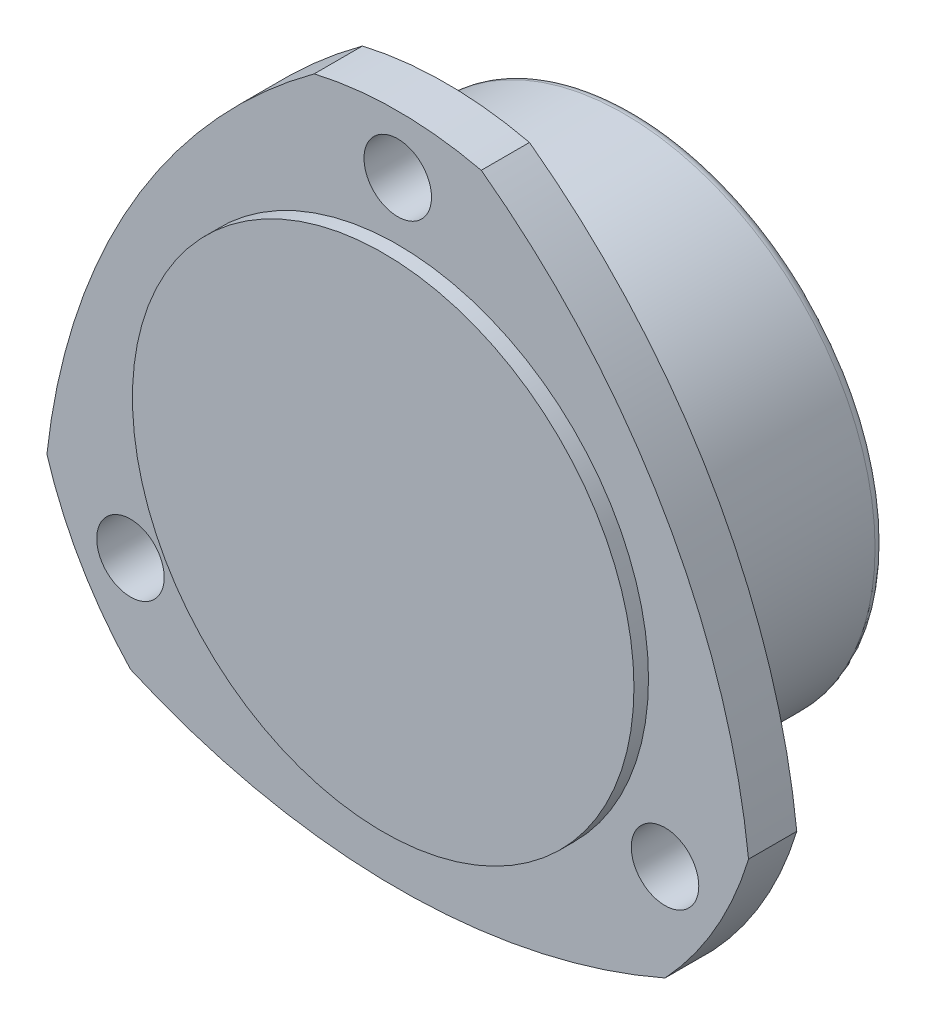
ISO-10303-21;
HEADER;
FILE_DESCRIPTION(('STEP AP214'),'2;1');
FILE_NAME('part.step','',(''),(''),'','','');
FILE_SCHEMA(('AUTOMOTIVE_DESIGN { 1 0 10303 214 1 1 1 1 }'));
ENDSEC;
DATA;
#1=APPLICATION_CONTEXT('core data for automotive mechanical design processes');
#2=APPLICATION_PROTOCOL_DEFINITION('international standard','automotive_design',2000,#1);
#3=PRODUCT_CONTEXT('',#1,'mechanical');
#4=PRODUCT('Part','Part','',(#3));
#5=PRODUCT_RELATED_PRODUCT_CATEGORY('part','',(#4));
#6=PRODUCT_DEFINITION_FORMATION('','',#4);
#7=PRODUCT_DEFINITION_CONTEXT('part definition',#1,'design');
#8=PRODUCT_DEFINITION('design','',#6,#7);
#9=PRODUCT_DEFINITION_SHAPE('','',#8);
#10=(LENGTH_UNIT() NAMED_UNIT(*) SI_UNIT(.MILLI.,.METRE.));
#11=(NAMED_UNIT(*) PLANE_ANGLE_UNIT() SI_UNIT($,.RADIAN.));
#12=(NAMED_UNIT(*) SI_UNIT($,.STERADIAN.) SOLID_ANGLE_UNIT());
#13=UNCERTAINTY_MEASURE_WITH_UNIT(LENGTH_MEASURE(1.E-05),#10,'distance_accuracy_value','');
#14=(GEOMETRIC_REPRESENTATION_CONTEXT(3) GLOBAL_UNCERTAINTY_ASSIGNED_CONTEXT((#13)) GLOBAL_UNIT_ASSIGNED_CONTEXT((#10,
#11,#12)) REPRESENTATION_CONTEXT('',''));
#15=CARTESIAN_POINT('',(0.,0.,0.));
#16=DIRECTION('',(0.,0.,1.));
#17=DIRECTION('',(1.,0.,0.));
#18=AXIS2_PLACEMENT_3D('',#15,#16,#17);
#19=CARTESIAN_POINT('',(-16.0214699700122,-9.25000000001742,-3.75));
#20=DIRECTION('',(0.,0.,1.));
#21=DIRECTION('',(1.,0.,0.));
#22=AXIS2_PLACEMENT_3D('',#19,#20,#21);
#23=CYLINDRICAL_SURFACE('',#22,34.412933615139);
#24=CARTESIAN_POINT('',(-16.0214699700122,-9.25000000001742,-1.25));
#25=DIRECTION('',(0.,0.,1.));
#26=DIRECTION('',(1.,0.,0.));
#27=AXIS2_PLACEMENT_3D('',#24,#25,#26);
#28=CIRCLE('',#27,34.412933615139);
#29=CARTESIAN_POINT('',(18.1865334794722,-5.50000000001337,-1.25));
#30=VERTEX_POINT('',#29);
#31=CARTESIAN_POINT('',(4.3301270189014,18.4999999999971,-1.25));
#32=VERTEX_POINT('',#31);
#33=EDGE_CURVE('E131',#30,#32,#28,.T.);
#34=ORIENTED_EDGE('',*,*,#33,.F.);
#35=DIRECTION('',(0.,0.,1.));
#36=VECTOR('',#35,1.);
#37=CARTESIAN_POINT('',(18.1865334794722,-5.50000000001337,-3.75));
#38=LINE('',#37,#36);
#39=CARTESIAN_POINT('',(18.1865334794722,-5.50000000001337,-3.75));
#40=VERTEX_POINT('',#39);
#41=EDGE_CURVE('E12',#40,#30,#38,.T.);
#42=ORIENTED_EDGE('',*,*,#41,.F.);
#43=CARTESIAN_POINT('',(-16.0214699700122,-9.25000000001742,-3.75));
#44=DIRECTION('',(0.,0.,1.));
#45=DIRECTION('',(1.,0.,0.));
#46=AXIS2_PLACEMENT_3D('',#43,#44,#45);
#47=CIRCLE('',#46,34.412933615139);
#48=CARTESIAN_POINT('',(4.3301270189014,18.4999999999971,-3.75));
#49=VERTEX_POINT('',#48);
#50=EDGE_CURVE('E146',#40,#49,#47,.T.);
#51=ORIENTED_EDGE('',*,*,#50,.T.);
#52=DIRECTION('',(0.,0.,1.));
#53=VECTOR('',#52,1.);
#54=CARTESIAN_POINT('',(4.3301270189014,18.4999999999971,-3.75));
#55=LINE('',#54,#53);
#56=EDGE_CURVE('E49',#49,#32,#55,.T.);
#57=ORIENTED_EDGE('',*,*,#56,.T.);
#58=EDGE_LOOP('',(#34,#42,#51,#57));
#59=FACE_BOUND('',#58,.T.);
#60=ADVANCED_FACE('F46',(#59),#23,.T.);
#61=CARTESIAN_POINT('',(-9.5090394420954E-13,-8.79696921744547E-12,-3.75));
#62=DIRECTION('',(0.,0.,1.));
#63=DIRECTION('',(1.,0.,0.));
#64=AXIS2_PLACEMENT_3D('',#61,#62,#63);
#65=CYLINDRICAL_SURFACE('',#64,19.0000000000012);
#66=CARTESIAN_POINT('',(-9.5090394420954E-13,-8.79696921744547E-12,-1.25));
#67=DIRECTION('',(0.,0.,1.));
#68=DIRECTION('',(1.,0.,0.));
#69=AXIS2_PLACEMENT_3D('',#66,#67,#68);
#70=CIRCLE('',#69,19.0000000000012);
#71=CARTESIAN_POINT('',(13.8564064605474,-13.0000000000135,-1.25));
#72=VERTEX_POINT('',#71);
#73=EDGE_CURVE('E144',#72,#30,#70,.T.);
#74=ORIENTED_EDGE('',*,*,#73,.F.);
#75=DIRECTION('',(0.,0.,1.));
#76=VECTOR('',#75,1.);
#77=CARTESIAN_POINT('',(13.8564064605474,-13.0000000000135,-3.75));
#78=LINE('',#77,#76);
#79=CARTESIAN_POINT('',(13.8564064605474,-13.0000000000135,-3.75));
#80=VERTEX_POINT('',#79);
#81=EDGE_CURVE('E55',#80,#72,#78,.T.);
#82=ORIENTED_EDGE('',*,*,#81,.F.);
#83=CARTESIAN_POINT('',(-9.5090394420954E-13,-8.79696921744547E-12,-3.75));
#84=DIRECTION('',(0.,0.,1.));
#85=DIRECTION('',(1.,0.,0.));
#86=AXIS2_PLACEMENT_3D('',#83,#84,#85);
#87=CIRCLE('',#86,19.0000000000012);
#88=EDGE_CURVE('E121',#80,#40,#87,.T.);
#89=ORIENTED_EDGE('',*,*,#88,.T.);
#90=ORIENTED_EDGE('',*,*,#41,.T.);
#91=EDGE_LOOP('',(#74,#82,#89,#90));
#92=FACE_BOUND('',#91,.T.);
#93=ADVANCED_FACE('F154',(#92),#65,.T.);
#94=CARTESIAN_POINT('',(2.90267257977158E-12,18.49999999999,-3.75));
#95=DIRECTION('',(0.,0.,1.));
#96=DIRECTION('',(1.,0.,0.));
#97=AXIS2_PLACEMENT_3D('',#94,#95,#96);
#98=CYLINDRICAL_SURFACE('',#97,34.4129336151401);
#99=CARTESIAN_POINT('',(2.90267257977158E-12,18.49999999999,-1.25));
#100=DIRECTION('',(0.,0.,1.));
#101=DIRECTION('',(1.,0.,0.));
#102=AXIS2_PLACEMENT_3D('',#99,#100,#101);
#103=CIRCLE('',#102,34.4129336151401);
#104=CARTESIAN_POINT('',(-13.8564064605547,-13.0000000000077,-1.25));
#105=VERTEX_POINT('',#104);
#106=EDGE_CURVE('E108',#105,#72,#103,.T.);
#107=ORIENTED_EDGE('',*,*,#106,.F.);
#108=DIRECTION('',(0.,0.,1.));
#109=VECTOR('',#108,1.);
#110=CARTESIAN_POINT('',(-13.8564064605547,-13.0000000000077,-3.75));
#111=LINE('',#110,#109);
#112=CARTESIAN_POINT('',(-13.8564064605547,-13.0000000000077,-3.75));
#113=VERTEX_POINT('',#112);
#114=EDGE_CURVE('E103',#113,#105,#111,.T.);
#115=ORIENTED_EDGE('',*,*,#114,.F.);
#116=CARTESIAN_POINT('',(2.90267257977158E-12,18.49999999999,-3.75));
#117=DIRECTION('',(0.,0.,1.));
#118=DIRECTION('',(1.,0.,0.));
#119=AXIS2_PLACEMENT_3D('',#116,#117,#118);
#120=CIRCLE('',#119,34.4129336151401);
#121=EDGE_CURVE('E106',#113,#80,#120,.T.);
#122=ORIENTED_EDGE('',*,*,#121,.T.);
#123=ORIENTED_EDGE('',*,*,#81,.T.);
#124=EDGE_LOOP('',(#107,#115,#122,#123));
#125=FACE_BOUND('',#124,.T.);
#126=ADVANCED_FACE('F105',(#125),#98,.T.);
#127=CARTESIAN_POINT('',(-9.5090394420954E-13,-8.79696921744547E-12,-3.75));
#128=DIRECTION('',(0.,0.,1.));
#129=DIRECTION('',(1.,0.,0.));
#130=AXIS2_PLACEMENT_3D('',#127,#128,#129);
#131=CYLINDRICAL_SURFACE('',#130,19.0000000000012);
#132=CARTESIAN_POINT('',(-9.5090394420954E-13,-8.79696921744547E-12,-1.25));
#133=DIRECTION('',(0.,0.,1.));
#134=DIRECTION('',(1.,0.,0.));
#135=AXIS2_PLACEMENT_3D('',#132,#133,#134);
#136=CIRCLE('',#135,19.0000000000012);
#137=CARTESIAN_POINT('',(-18.1865334794743,-5.50000000001249,-1.25));
#138=VERTEX_POINT('',#137);
#139=EDGE_CURVE('E141',#138,#105,#136,.T.);
#140=ORIENTED_EDGE('',*,*,#139,.F.);
#141=DIRECTION('',(0.,0.,1.));
#142=VECTOR('',#141,1.);
#143=CARTESIAN_POINT('',(-18.1865334794743,-5.50000000001249,-3.75));
#144=LINE('',#143,#142);
#145=CARTESIAN_POINT('',(-18.1865334794743,-5.50000000001249,-3.75));
#146=VERTEX_POINT('',#145);
#147=EDGE_CURVE('E113',#146,#138,#144,.T.);
#148=ORIENTED_EDGE('',*,*,#147,.F.);
#149=CARTESIAN_POINT('',(-9.5090394420954E-13,-8.79696921744547E-12,-3.75));
#150=DIRECTION('',(0.,0.,1.));
#151=DIRECTION('',(1.,0.,0.));
#152=AXIS2_PLACEMENT_3D('',#149,#150,#151);
#153=CIRCLE('',#152,19.0000000000012);
#154=EDGE_CURVE('E119',#146,#113,#153,.T.);
#155=ORIENTED_EDGE('',*,*,#154,.T.);
#156=ORIENTED_EDGE('',*,*,#114,.T.);
#157=EDGE_LOOP('',(#140,#148,#155,#156));
#158=FACE_BOUND('',#157,.T.);
#159=ADVANCED_FACE('F123',(#158),#131,.T.);
#160=CARTESIAN_POINT('',(16.0214699700033,-9.25000000001388,-3.75));
#161=DIRECTION('',(0.,0.,1.));
#162=DIRECTION('',(1.,0.,0.));
#163=AXIS2_PLACEMENT_3D('',#160,#161,#162);
#164=CYLINDRICAL_SURFACE('',#163,34.412933615132);
#165=CARTESIAN_POINT('',(16.0214699700033,-9.25000000001388,-1.25));
#166=DIRECTION('',(0.,0.,1.));
#167=DIRECTION('',(1.,0.,0.));
#168=AXIS2_PLACEMENT_3D('',#165,#166,#167);
#169=CIRCLE('',#168,34.412933615132);
#170=CARTESIAN_POINT('',(-4.33012701890331,18.4999999999971,-1.25));
#171=VERTEX_POINT('',#170);
#172=EDGE_CURVE('E138',#171,#138,#169,.T.);
#173=ORIENTED_EDGE('',*,*,#172,.F.);
#174=DIRECTION('',(0.,0.,1.));
#175=VECTOR('',#174,1.);
#176=CARTESIAN_POINT('',(-4.33012701890331,18.4999999999971,-3.75));
#177=LINE('',#176,#175);
#178=CARTESIAN_POINT('',(-4.33012701890331,18.4999999999971,-3.75));
#179=VERTEX_POINT('',#178);
#180=EDGE_CURVE('E149',#179,#171,#177,.T.);
#181=ORIENTED_EDGE('',*,*,#180,.F.);
#182=CARTESIAN_POINT('',(16.0214699700033,-9.25000000001388,-3.75));
#183=DIRECTION('',(0.,0.,1.));
#184=DIRECTION('',(1.,0.,0.));
#185=AXIS2_PLACEMENT_3D('',#182,#183,#184);
#186=CIRCLE('',#185,34.412933615132);
#187=EDGE_CURVE('E124',#179,#146,#186,.T.);
#188=ORIENTED_EDGE('',*,*,#187,.T.);
#189=ORIENTED_EDGE('',*,*,#147,.T.);
#190=EDGE_LOOP('',(#173,#181,#188,#189));
#191=FACE_BOUND('',#190,.T.);
#192=ADVANCED_FACE('F167',(#191),#164,.T.);
#193=CARTESIAN_POINT('',(-9.5090394420954E-13,-8.79696921744547E-12,-3.75));
#194=DIRECTION('',(0.,0.,1.));
#195=DIRECTION('',(1.,0.,0.));
#196=AXIS2_PLACEMENT_3D('',#193,#194,#195);
#197=CYLINDRICAL_SURFACE('',#196,19.0000000000012);
#198=CARTESIAN_POINT('',(-9.5090394420954E-13,-8.79696921744547E-12,-1.25));
#199=DIRECTION('',(0.,0.,1.));
#200=DIRECTION('',(1.,0.,0.));
#201=AXIS2_PLACEMENT_3D('',#198,#199,#200);
#202=CIRCLE('',#201,19.0000000000012);
#203=EDGE_CURVE('E134',#32,#171,#202,.T.);
#204=ORIENTED_EDGE('',*,*,#203,.F.);
#205=ORIENTED_EDGE('',*,*,#56,.F.);
#206=CARTESIAN_POINT('',(-9.5090394420954E-13,-8.79696921744547E-12,-3.75));
#207=DIRECTION('',(0.,0.,1.));
#208=DIRECTION('',(1.,0.,0.));
#209=AXIS2_PLACEMENT_3D('',#206,#207,#208);
#210=CIRCLE('',#209,19.0000000000012);
#211=EDGE_CURVE('E126',#49,#179,#210,.T.);
#212=ORIENTED_EDGE('',*,*,#211,.T.);
#213=ORIENTED_EDGE('',*,*,#180,.T.);
#214=EDGE_LOOP('',(#204,#205,#212,#213));
#215=FACE_BOUND('',#214,.T.);
#216=ADVANCED_FACE('F151',(#215),#197,.T.);
#217=CARTESIAN_POINT('',(-8.01073498500656,-4.62500000001311,-3.75));
#218=DIRECTION('',(0.,0.,1.));
#219=DIRECTION('',(1.,0.,0.));
#220=AXIS2_PLACEMENT_3D('',#217,#218,#219);
#221=PLANE('',#220);
#222=CARTESIAN_POINT('',(-13.8564064605547,-8.0000000000062,-3.75));
#223=DIRECTION('',(0.,0.,1.));
#224=DIRECTION('',(1.,0.,0.));
#225=AXIS2_PLACEMENT_3D('',#222,#223,#224);
#226=CIRCLE('',#225,1.74999999999639);
#227=CARTESIAN_POINT('',(-12.1064064605583,-8.0000000000062,-3.75));
#228=VERTEX_POINT('',#227);
#229=EDGE_CURVE('E201',#228,#228,#226,.T.);
#230=ORIENTED_EDGE('',*,*,#229,.T.);
#231=EDGE_LOOP('',(#230));
#232=FACE_BOUND('',#231,.T.);
#233=CARTESIAN_POINT('',(13.8564064605474,-8.00000000000932,-3.75));
#234=DIRECTION('',(0.,0.,1.));
#235=DIRECTION('',(1.,0.,0.));
#236=AXIS2_PLACEMENT_3D('',#233,#234,#235);
#237=CIRCLE('',#236,1.74999999999896);
#238=CARTESIAN_POINT('',(15.6064064605463,-8.00000000000932,-3.75));
#239=VERTEX_POINT('',#238);
#240=EDGE_CURVE('E209',#239,#239,#237,.T.);
#241=ORIENTED_EDGE('',*,*,#240,.T.);
#242=EDGE_LOOP('',(#241));
#243=FACE_BOUND('',#242,.T.);
#244=CARTESIAN_POINT('',(-9.5090394420954E-13,15.9999999999922,-3.75));
#245=DIRECTION('',(0.,0.,1.));
#246=DIRECTION('',(1.,0.,0.));
#247=AXIS2_PLACEMENT_3D('',#244,#245,#246);
#248=CIRCLE('',#247,1.7499999999997);
#249=CARTESIAN_POINT('',(1.74999999999875,15.9999999999922,-3.75));
#250=VERTEX_POINT('',#249);
#251=EDGE_CURVE('E215',#250,#250,#248,.T.);
#252=ORIENTED_EDGE('',*,*,#251,.T.);
#253=EDGE_LOOP('',(#252));
#254=FACE_BOUND('',#253,.T.);
#255=CARTESIAN_POINT('',(-9.5090394420954E-13,-8.79696921744547E-12,-3.75));
#256=DIRECTION('',(0.,0.,1.));
#257=DIRECTION('',(1.,0.,0.));
#258=AXIS2_PLACEMENT_3D('',#255,#256,#257);
#259=CIRCLE('',#258,13.);
#260=CARTESIAN_POINT('',(12.999999999999,-8.79696921744547E-12,-3.75));
#261=VERTEX_POINT('',#260);
#262=EDGE_CURVE('E135',#261,#261,#259,.T.);
#263=ORIENTED_EDGE('',*,*,#262,.T.);
#264=EDGE_LOOP('',(#263));
#265=FACE_BOUND('',#264,.T.);
#266=ORIENTED_EDGE('',*,*,#50,.F.);
#267=ORIENTED_EDGE('',*,*,#88,.F.);
#268=ORIENTED_EDGE('',*,*,#121,.F.);
#269=ORIENTED_EDGE('',*,*,#154,.F.);
#270=ORIENTED_EDGE('',*,*,#187,.F.);
#271=ORIENTED_EDGE('',*,*,#211,.F.);
#272=EDGE_LOOP('',(#266,#267,#268,#269,#270,#271));
#273=FACE_BOUND('',#272,.T.);
#274=ADVANCED_FACE('F117',(#232,#243,#254,#265,#273),#221,.F.);
#275=CARTESIAN_POINT('',(-8.01073498500656,-4.62500000001311,-1.25));
#276=DIRECTION('',(0.,0.,1.));
#277=DIRECTION('',(1.,0.,0.));
#278=AXIS2_PLACEMENT_3D('',#275,#276,#277);
#279=PLANE('',#278);
#280=CARTESIAN_POINT('',(-13.8564064605547,-8.0000000000062,-1.25));
#281=DIRECTION('',(0.,0.,1.));
#282=DIRECTION('',(1.,0.,0.));
#283=AXIS2_PLACEMENT_3D('',#280,#281,#282);
#284=CIRCLE('',#283,1.74999999999639);
#285=CARTESIAN_POINT('',(-12.1064064605583,-8.0000000000062,-1.25));
#286=VERTEX_POINT('',#285);
#287=EDGE_CURVE('E204',#286,#286,#284,.T.);
#288=ORIENTED_EDGE('',*,*,#287,.F.);
#289=EDGE_LOOP('',(#288));
#290=FACE_BOUND('',#289,.T.);
#291=CARTESIAN_POINT('',(13.8564064605474,-8.00000000000932,-1.25));
#292=DIRECTION('',(0.,0.,1.));
#293=DIRECTION('',(1.,0.,0.));
#294=AXIS2_PLACEMENT_3D('',#291,#292,#293);
#295=CIRCLE('',#294,1.74999999999896);
#296=CARTESIAN_POINT('',(15.6064064605463,-8.00000000000932,-1.25));
#297=VERTEX_POINT('',#296);
#298=EDGE_CURVE('E206',#297,#297,#295,.T.);
#299=ORIENTED_EDGE('',*,*,#298,.F.);
#300=EDGE_LOOP('',(#299));
#301=FACE_BOUND('',#300,.T.);
#302=CARTESIAN_POINT('',(-9.5090394420954E-13,15.9999999999922,-1.25));
#303=DIRECTION('',(0.,0.,1.));
#304=DIRECTION('',(1.,0.,0.));
#305=AXIS2_PLACEMENT_3D('',#302,#303,#304);
#306=CIRCLE('',#305,1.7499999999997);
#307=CARTESIAN_POINT('',(1.74999999999875,15.9999999999922,-1.25));
#308=VERTEX_POINT('',#307);
#309=EDGE_CURVE('E212',#308,#308,#306,.T.);
#310=ORIENTED_EDGE('',*,*,#309,.F.);
#311=EDGE_LOOP('',(#310));
#312=FACE_BOUND('',#311,.T.);
#313=CARTESIAN_POINT('',(-9.5090394420954E-13,-8.79696921744547E-12,-1.25));
#314=DIRECTION('',(0.,0.,1.));
#315=DIRECTION('',(1.,0.,0.));
#316=AXIS2_PLACEMENT_3D('',#313,#314,#315);
#317=CIRCLE('',#316,13.);
#318=CARTESIAN_POINT('',(12.999999999999,-8.79696921744547E-12,-1.25));
#319=VERTEX_POINT('',#318);
#320=EDGE_CURVE('E218',#319,#319,#317,.T.);
#321=ORIENTED_EDGE('',*,*,#320,.F.);
#322=EDGE_LOOP('',(#321));
#323=FACE_BOUND('',#322,.T.);
#324=ORIENTED_EDGE('',*,*,#33,.T.);
#325=ORIENTED_EDGE('',*,*,#203,.T.);
#326=ORIENTED_EDGE('',*,*,#172,.T.);
#327=ORIENTED_EDGE('',*,*,#139,.T.);
#328=ORIENTED_EDGE('',*,*,#106,.T.);
#329=ORIENTED_EDGE('',*,*,#73,.T.);
#330=EDGE_LOOP('',(#324,#325,#326,#327,#328,#329));
#331=FACE_BOUND('',#330,.T.);
#332=ADVANCED_FACE('F153',(#290,#301,#312,#323,#331),#279,.T.);
#333=CARTESIAN_POINT('',(-9.5090394420954E-13,-8.79696921744547E-12,-3.75));
#334=DIRECTION('',(0.,0.,1.));
#335=DIRECTION('',(1.,0.,0.));
#336=AXIS2_PLACEMENT_3D('',#333,#334,#335);
#337=CYLINDRICAL_SURFACE('',#336,13.);
#338=ORIENTED_EDGE('',*,*,#262,.F.);
#339=EDGE_LOOP('',(#338));
#340=FACE_BOUND('',#339,.T.);
#341=ORIENTED_EDGE('',*,*,#320,.T.);
#342=EDGE_LOOP('',(#341));
#343=FACE_BOUND('',#342,.T.);
#344=ADVANCED_FACE('F178',(#340,#343),#337,.F.);
#345=CARTESIAN_POINT('',(-9.5090394420954E-13,15.9999999999922,-3.75));
#346=DIRECTION('',(0.,0.,1.));
#347=DIRECTION('',(1.,0.,0.));
#348=AXIS2_PLACEMENT_3D('',#345,#346,#347);
#349=CYLINDRICAL_SURFACE('',#348,1.7499999999997);
#350=ORIENTED_EDGE('',*,*,#251,.F.);
#351=EDGE_LOOP('',(#350));
#352=FACE_BOUND('',#351,.T.);
#353=ORIENTED_EDGE('',*,*,#309,.T.);
#354=EDGE_LOOP('',(#353));
#355=FACE_BOUND('',#354,.T.);
#356=ADVANCED_FACE('F185',(#352,#355),#349,.F.);
#357=CARTESIAN_POINT('',(13.8564064605474,-8.00000000000932,-3.75));
#358=DIRECTION('',(0.,0.,1.));
#359=DIRECTION('',(1.,0.,0.));
#360=AXIS2_PLACEMENT_3D('',#357,#358,#359);
#361=CYLINDRICAL_SURFACE('',#360,1.74999999999896);
#362=ORIENTED_EDGE('',*,*,#240,.F.);
#363=EDGE_LOOP('',(#362));
#364=FACE_BOUND('',#363,.T.);
#365=ORIENTED_EDGE('',*,*,#298,.T.);
#366=EDGE_LOOP('',(#365));
#367=FACE_BOUND('',#366,.T.);
#368=ADVANCED_FACE('F189',(#364,#367),#361,.F.);
#369=CARTESIAN_POINT('',(-13.8564064605547,-8.0000000000062,-3.75));
#370=DIRECTION('',(0.,0.,1.));
#371=DIRECTION('',(1.,0.,0.));
#372=AXIS2_PLACEMENT_3D('',#369,#370,#371);
#373=CYLINDRICAL_SURFACE('',#372,1.74999999999639);
#374=ORIENTED_EDGE('',*,*,#229,.F.);
#375=EDGE_LOOP('',(#374));
#376=FACE_BOUND('',#375,.T.);
#377=ORIENTED_EDGE('',*,*,#287,.T.);
#378=EDGE_LOOP('',(#377));
#379=FACE_BOUND('',#378,.T.);
#380=ADVANCED_FACE('F193',(#376,#379),#373,.F.);
#381=CLOSED_SHELL('',(#60,#93,#126,#159,#192,#216,#274,#332,#344,#356,#368,#380));
#382=MANIFOLD_SOLID_BREP('B2',#381);
#383=CARTESIAN_POINT('',(0.,0.,-13.4959765173449));
#384=DIRECTION('',(0.,0.,1.));
#385=DIRECTION('',(1.,0.,0.));
#386=AXIS2_PLACEMENT_3D('',#383,#384,#385);
#387=CYLINDRICAL_SURFACE('',#386,13.);
#388=CARTESIAN_POINT('',(0.,0.,-12.9959765173449));
#389=DIRECTION('',(0.,0.,1.));
#390=DIRECTION('',(1.,0.,0.));
#391=AXIS2_PLACEMENT_3D('',#388,#389,#390);
#392=CIRCLE('',#391,13.);
#393=CARTESIAN_POINT('',(13.,0.,-12.9959765173449));
#394=VERTEX_POINT('',#393);
#395=EDGE_CURVE('E312',#394,#394,#392,.T.);
#396=ORIENTED_EDGE('',*,*,#395,.T.);
#397=EDGE_LOOP('',(#396));
#398=FACE_BOUND('',#397,.T.);
#399=CARTESIAN_POINT('',(0.,0.,-0.495976517344863));
#400=DIRECTION('',(0.,0.,1.));
#401=DIRECTION('',(1.,0.,0.));
#402=AXIS2_PLACEMENT_3D('',#399,#400,#401);
#403=CIRCLE('',#402,13.);
#404=CARTESIAN_POINT('',(13.,0.,-0.495976517344863));
#405=VERTEX_POINT('',#404);
#406=EDGE_CURVE('E316',#405,#405,#403,.T.);
#407=ORIENTED_EDGE('',*,*,#406,.F.);
#408=EDGE_LOOP('',(#407));
#409=FACE_BOUND('',#408,.T.);
#410=ADVANCED_FACE('F305',(#398,#409),#387,.T.);
#411=CARTESIAN_POINT('',(0.,0.,-13.4959765173449));
#412=DIRECTION('',(0.,0.,1.));
#413=DIRECTION('',(1.,0.,0.));
#414=AXIS2_PLACEMENT_3D('',#411,#412,#413);
#415=PLANE('',#414);
#416=CARTESIAN_POINT('',(0.,0.,-13.4959765173449));
#417=DIRECTION('',(0.,0.,1.));
#418=DIRECTION('',(1.,0.,0.));
#419=AXIS2_PLACEMENT_3D('',#416,#417,#418);
#420=CIRCLE('',#419,12.5);
#421=CARTESIAN_POINT('',(12.5,0.,-13.4959765173449));
#422=VERTEX_POINT('',#421);
#423=EDGE_CURVE('E45',#422,#422,#420,.F.);
#424=ORIENTED_EDGE('',*,*,#423,.T.);
#425=EDGE_LOOP('',(#424));
#426=FACE_BOUND('',#425,.T.);
#427=ADVANCED_FACE('F326',(#426),#415,.F.);
#428=CARTESIAN_POINT('',(0.,0.,-0.495976517344863));
#429=DIRECTION('',(0.,0.,1.));
#430=DIRECTION('',(1.,0.,0.));
#431=AXIS2_PLACEMENT_3D('',#428,#429,#430);
#432=PLANE('',#431);
#433=ORIENTED_EDGE('',*,*,#406,.T.);
#434=EDGE_LOOP('',(#433));
#435=FACE_BOUND('',#434,.T.);
#436=ADVANCED_FACE('F323',(#435),#432,.T.);
#437=CARTESIAN_POINT('',(0.,0.,-12.9959765173449));
#438=DIRECTION('',(0.,0.,1.));
#439=DIRECTION('',(1.,0.,0.));
#440=AXIS2_PLACEMENT_3D('',#437,#438,#439);
#441=TOROIDAL_SURFACE('',#440,12.5,0.5);
#442=ORIENTED_EDGE('',*,*,#423,.F.);
#443=EDGE_LOOP('',(#442));
#444=FACE_BOUND('',#443,.T.);
#445=ORIENTED_EDGE('',*,*,#395,.F.);
#446=EDGE_LOOP('',(#445));
#447=FACE_BOUND('',#446,.T.);
#448=ADVANCED_FACE('F307',(#444,#447),#441,.T.);
#449=CLOSED_SHELL('',(#410,#427,#436,#448));
#450=MANIFOLD_SOLID_BREP('B6',#449);
#451=ADVANCED_BREP_SHAPE_REPRESENTATION('',(#18,#382,#450),#14);
#452=SHAPE_DEFINITION_REPRESENTATION(#9,#451);
ENDSEC;
END-ISO-10303-21;
